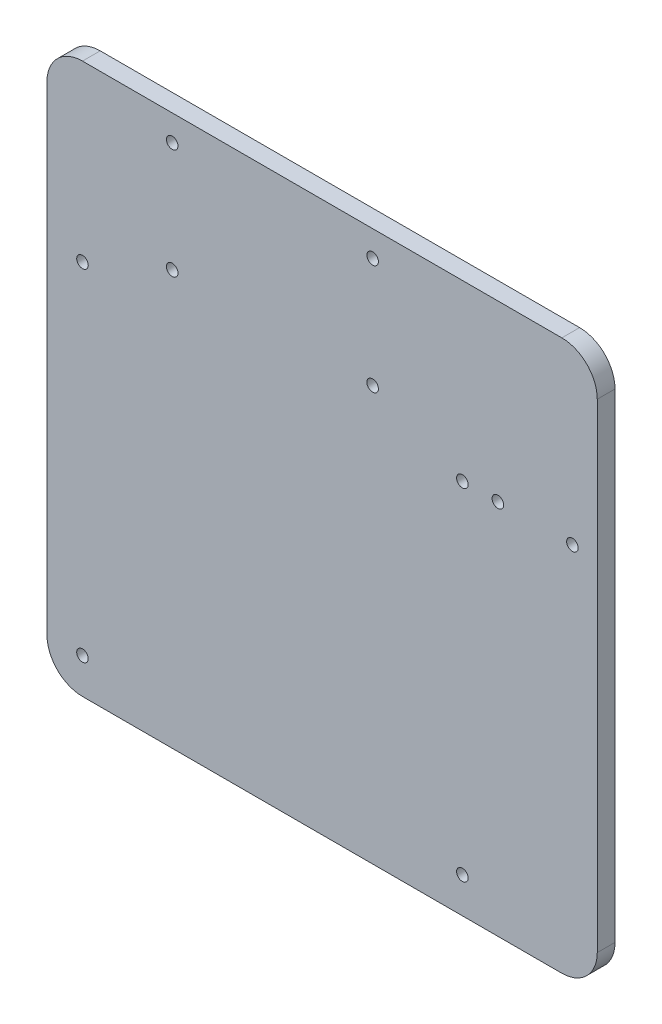
ISO-10303-21;
HEADER;
FILE_DESCRIPTION(('STEP AP214'),'2;1');
FILE_NAME('part.step','',(''),(''),'','','');
FILE_SCHEMA(('AUTOMOTIVE_DESIGN { 1 0 10303 214 1 1 1 1 }'));
ENDSEC;
DATA;
#1=APPLICATION_CONTEXT('core data for automotive mechanical design processes');
#2=APPLICATION_PROTOCOL_DEFINITION('international standard','automotive_design',2000,#1);
#3=PRODUCT_CONTEXT('',#1,'mechanical');
#4=PRODUCT('Part','Part','',(#3));
#5=PRODUCT_RELATED_PRODUCT_CATEGORY('part','',(#4));
#6=PRODUCT_DEFINITION_FORMATION('','',#4);
#7=PRODUCT_DEFINITION_CONTEXT('part definition',#1,'design');
#8=PRODUCT_DEFINITION('design','',#6,#7);
#9=PRODUCT_DEFINITION_SHAPE('','',#8);
#10=(LENGTH_UNIT() NAMED_UNIT(*) SI_UNIT(.MILLI.,.METRE.));
#11=(NAMED_UNIT(*) PLANE_ANGLE_UNIT() SI_UNIT($,.RADIAN.));
#12=(NAMED_UNIT(*) SI_UNIT($,.STERADIAN.) SOLID_ANGLE_UNIT());
#13=UNCERTAINTY_MEASURE_WITH_UNIT(LENGTH_MEASURE(1.E-05),#10,'distance_accuracy_value','');
#14=(GEOMETRIC_REPRESENTATION_CONTEXT(3) GLOBAL_UNCERTAINTY_ASSIGNED_CONTEXT((#13)) GLOBAL_UNIT_ASSIGNED_CONTEXT((#10,
#11,#12)) REPRESENTATION_CONTEXT('',''));
#15=CARTESIAN_POINT('',(0.,0.,0.));
#16=DIRECTION('',(0.,0.,1.));
#17=DIRECTION('',(1.,0.,0.));
#18=AXIS2_PLACEMENT_3D('',#15,#16,#17);
#19=CARTESIAN_POINT('',(-75.,75.,5.));
#20=DIRECTION('',(1.,0.,0.));
#21=DIRECTION('',(0.,1.,0.));
#22=AXIS2_PLACEMENT_3D('',#19,#20,#21);
#23=PLANE('',#22);
#24=DIRECTION('',(0.,0.,1.));
#25=VECTOR('',#24,1.);
#26=CARTESIAN_POINT('',(-75.,-65.,0.));
#27=LINE('',#26,#25);
#28=CARTESIAN_POINT('',(-75.,-65.,0.));
#29=VERTEX_POINT('',#28);
#30=CARTESIAN_POINT('',(-74.9999999999992,-65.,5.));
#31=VERTEX_POINT('',#30);
#32=EDGE_CURVE('E96',#29,#31,#27,.T.);
#33=ORIENTED_EDGE('',*,*,#32,.T.);
#34=DIRECTION('',(0.,-1.,0.));
#35=VECTOR('',#34,1.);
#36=CARTESIAN_POINT('',(-75.,75.,5.));
#37=LINE('',#36,#35);
#38=CARTESIAN_POINT('',(-75.,70.0055578210012,5.));
#39=VERTEX_POINT('',#38);
#40=EDGE_CURVE('E11',#39,#31,#37,.T.);
#41=ORIENTED_EDGE('',*,*,#40,.F.);
#42=DIRECTION('',(0.,0.,1.));
#43=VECTOR('',#42,1.);
#44=CARTESIAN_POINT('',(-75.,70.0055578210012,0.));
#45=LINE('',#44,#43);
#46=CARTESIAN_POINT('',(-75.,70.0055578210012,0.));
#47=VERTEX_POINT('',#46);
#48=EDGE_CURVE('E116',#47,#39,#45,.T.);
#49=ORIENTED_EDGE('',*,*,#48,.F.);
#50=DIRECTION('',(0.,-1.,0.));
#51=VECTOR('',#50,1.);
#52=CARTESIAN_POINT('',(-75.,75.,0.));
#53=LINE('',#52,#51);
#54=EDGE_CURVE('E112',#47,#29,#53,.T.);
#55=ORIENTED_EDGE('',*,*,#54,.T.);
#56=EDGE_LOOP('',(#33,#41,#49,#55));
#57=FACE_BOUND('',#56,.T.);
#58=ADVANCED_FACE('F31',(#57),#23,.F.);
#59=CARTESIAN_POINT('',(-75.,-75.,5.));
#60=DIRECTION('',(0.,1.,0.));
#61=DIRECTION('',(-1.,0.,0.));
#62=AXIS2_PLACEMENT_3D('',#59,#60,#61);
#63=PLANE('',#62);
#64=DIRECTION('',(1.,0.,0.));
#65=VECTOR('',#64,1.);
#66=CARTESIAN_POINT('',(80.,-75.,5.));
#67=LINE('',#66,#65);
#68=CARTESIAN_POINT('',(-65.,-75.,5.));
#69=VERTEX_POINT('',#68);
#70=CARTESIAN_POINT('',(69.9697939002767,-75.,5.));
#71=VERTEX_POINT('',#70);
#72=EDGE_CURVE('E55',#69,#71,#67,.T.);
#73=ORIENTED_EDGE('',*,*,#72,.F.);
#74=DIRECTION('',(0.,0.,1.));
#75=VECTOR('',#74,1.);
#76=CARTESIAN_POINT('',(-65.,-75.,0.));
#77=LINE('',#76,#75);
#78=CARTESIAN_POINT('',(-65.,-75.,0.));
#79=VERTEX_POINT('',#78);
#80=EDGE_CURVE('E104',#79,#69,#77,.T.);
#81=ORIENTED_EDGE('',*,*,#80,.F.);
#82=DIRECTION('',(1.,0.,0.));
#83=VECTOR('',#82,1.);
#84=CARTESIAN_POINT('',(-75.,-75.,0.));
#85=LINE('',#84,#83);
#86=CARTESIAN_POINT('',(69.9697939002767,-75.,0.));
#87=VERTEX_POINT('',#86);
#88=EDGE_CURVE('E35',#79,#87,#85,.T.);
#89=ORIENTED_EDGE('',*,*,#88,.T.);
#90=DIRECTION('',(0.,0.,1.));
#91=VECTOR('',#90,1.);
#92=CARTESIAN_POINT('',(69.9697939002767,-75.,0.));
#93=LINE('',#92,#91);
#94=EDGE_CURVE('E207',#87,#71,#93,.T.);
#95=ORIENTED_EDGE('',*,*,#94,.T.);
#96=EDGE_LOOP('',(#73,#81,#89,#95));
#97=FACE_BOUND('',#96,.T.);
#98=ADVANCED_FACE('F220',(#97),#63,.F.);
#99=CARTESIAN_POINT('',(80.,80.,5.));
#100=DIRECTION('',(-1.,0.,0.));
#101=DIRECTION('',(0.,0.,1.));
#102=AXIS2_PLACEMENT_3D('',#99,#100,#101);
#103=PLANE('',#102);
#104=DIRECTION('',(0.,1.,0.));
#105=VECTOR('',#104,1.);
#106=CARTESIAN_POINT('',(80.,80.,5.));
#107=LINE('',#106,#105);
#108=CARTESIAN_POINT('',(80.,-64.9697939002768,5.));
#109=VERTEX_POINT('',#108);
#110=CARTESIAN_POINT('',(80.,70.024463879748,5.));
#111=VERTEX_POINT('',#110);
#112=EDGE_CURVE('E124',#109,#111,#107,.T.);
#113=ORIENTED_EDGE('',*,*,#112,.F.);
#114=DIRECTION('',(0.,0.,1.));
#115=VECTOR('',#114,1.);
#116=CARTESIAN_POINT('',(80.,-64.9697939002768,0.));
#117=LINE('',#116,#115);
#118=CARTESIAN_POINT('',(80.,-64.9697939002768,0.));
#119=VERTEX_POINT('',#118);
#120=EDGE_CURVE('E204',#119,#109,#117,.T.);
#121=ORIENTED_EDGE('',*,*,#120,.F.);
#122=DIRECTION('',(0.,1.,0.));
#123=VECTOR('',#122,1.);
#124=CARTESIAN_POINT('',(80.,80.,0.));
#125=LINE('',#124,#123);
#126=CARTESIAN_POINT('',(80.,70.024463879748,0.));
#127=VERTEX_POINT('',#126);
#128=EDGE_CURVE('E118',#119,#127,#125,.T.);
#129=ORIENTED_EDGE('',*,*,#128,.T.);
#130=DIRECTION('',(0.,0.,1.));
#131=VECTOR('',#130,1.);
#132=CARTESIAN_POINT('',(80.,70.024463879748,0.));
#133=LINE('',#132,#131);
#134=EDGE_CURVE('E196',#127,#111,#133,.T.);
#135=ORIENTED_EDGE('',*,*,#134,.T.);
#136=EDGE_LOOP('',(#113,#121,#129,#135));
#137=FACE_BOUND('',#136,.T.);
#138=ADVANCED_FACE('F33',(#137),#103,.F.);
#139=CARTESIAN_POINT('',(-75.,80.,5.));
#140=DIRECTION('',(0.,-1.,0.));
#141=DIRECTION('',(0.,0.,-1.));
#142=AXIS2_PLACEMENT_3D('',#139,#140,#141);
#143=PLANE('',#142);
#144=DIRECTION('',(-1.,0.,0.));
#145=VECTOR('',#144,1.);
#146=CARTESIAN_POINT('',(75.,80.,5.));
#147=LINE('',#146,#145);
#148=CARTESIAN_POINT('',(70.024463879748,80.,5.));
#149=VERTEX_POINT('',#148);
#150=CARTESIAN_POINT('',(-65.0055578210013,80.,5.));
#151=VERTEX_POINT('',#150);
#152=EDGE_CURVE('E40',#149,#151,#147,.T.);
#153=ORIENTED_EDGE('',*,*,#152,.F.);
#154=DIRECTION('',(0.,0.,1.));
#155=VECTOR('',#154,1.);
#156=CARTESIAN_POINT('',(70.024463879748,80.,0.));
#157=LINE('',#156,#155);
#158=CARTESIAN_POINT('',(70.024463879748,80.,0.));
#159=VERTEX_POINT('',#158);
#160=EDGE_CURVE('E194',#159,#149,#157,.T.);
#161=ORIENTED_EDGE('',*,*,#160,.F.);
#162=DIRECTION('',(-1.,0.,0.));
#163=VECTOR('',#162,1.);
#164=CARTESIAN_POINT('',(-75.,80.,0.));
#165=LINE('',#164,#163);
#166=CARTESIAN_POINT('',(-65.0055578210013,80.,0.));
#167=VERTEX_POINT('',#166);
#168=EDGE_CURVE('E117',#159,#167,#165,.T.);
#169=ORIENTED_EDGE('',*,*,#168,.T.);
#170=DIRECTION('',(0.,0.,1.));
#171=VECTOR('',#170,1.);
#172=CARTESIAN_POINT('',(-65.0055578210013,80.,0.));
#173=LINE('',#172,#171);
#174=EDGE_CURVE('E186',#167,#151,#173,.T.);
#175=ORIENTED_EDGE('',*,*,#174,.T.);
#176=EDGE_LOOP('',(#153,#161,#169,#175));
#177=FACE_BOUND('',#176,.T.);
#178=ADVANCED_FACE('F236',(#177),#143,.F.);
#179=CARTESIAN_POINT('',(-75.,-74.9999999999996,5.));
#180=DIRECTION('',(0.,0.,1.));
#181=DIRECTION('',(1.,0.,0.));
#182=AXIS2_PLACEMENT_3D('',#179,#180,#181);
#183=PLANE('',#182);
#184=CARTESIAN_POINT('',(-65.,-65.,5.));
#185=DIRECTION('',(0.,0.,-1.));
#186=DIRECTION('',(1.,0.,0.));
#187=AXIS2_PLACEMENT_3D('',#184,#185,#186);
#188=CIRCLE('',#187,9.99999999999999);
#189=EDGE_CURVE('E48',#69,#31,#188,.T.);
#190=ORIENTED_EDGE('',*,*,#189,.F.);
#191=ORIENTED_EDGE('',*,*,#72,.T.);
#192=CARTESIAN_POINT('',(69.9697939002767,-64.9697939002768,5.));
#193=DIRECTION('',(0.,0.,-1.));
#194=DIRECTION('',(1.,0.,0.));
#195=AXIS2_PLACEMENT_3D('',#192,#193,#194);
#196=CIRCLE('',#195,10.0302060997233);
#197=EDGE_CURVE('E212',#109,#71,#196,.T.);
#198=ORIENTED_EDGE('',*,*,#197,.F.);
#199=ORIENTED_EDGE('',*,*,#112,.T.);
#200=CARTESIAN_POINT('',(70.024463879748,70.024463879748,5.));
#201=DIRECTION('',(0.,0.,-1.));
#202=DIRECTION('',(1.,0.,0.));
#203=AXIS2_PLACEMENT_3D('',#200,#201,#202);
#204=CIRCLE('',#203,9.97553612025197);
#205=EDGE_CURVE('E201',#149,#111,#204,.T.);
#206=ORIENTED_EDGE('',*,*,#205,.F.);
#207=ORIENTED_EDGE('',*,*,#152,.T.);
#208=CARTESIAN_POINT('',(-65.0055578210013,70.0055578210012,5.));
#209=DIRECTION('',(0.,0.,-1.));
#210=DIRECTION('',(1.,0.,0.));
#211=AXIS2_PLACEMENT_3D('',#208,#209,#210);
#212=CIRCLE('',#211,9.99444217899877);
#213=EDGE_CURVE('E191',#39,#151,#212,.T.);
#214=ORIENTED_EDGE('',*,*,#213,.F.);
#215=ORIENTED_EDGE('',*,*,#40,.T.);
#216=EDGE_LOOP('',(#190,#191,#198,#199,#206,#207,#214,#215));
#217=FACE_BOUND('',#216,.T.);
#218=CARTESIAN_POINT('',(16.7280677159057,41.7212113135208,5.));
#219=DIRECTION('',(0.,0.,1.));
#220=DIRECTION('',(1.,0.,0.));
#221=AXIS2_PLACEMENT_3D('',#218,#219,#220);
#222=CIRCLE('',#221,1.625);
#223=CARTESIAN_POINT('',(18.3530677159057,41.7212113135208,5.));
#224=VERTEX_POINT('',#223);
#225=EDGE_CURVE('E172',#224,#224,#222,.T.);
#226=ORIENTED_EDGE('',*,*,#225,.F.);
#227=EDGE_LOOP('',(#226));
#228=FACE_BOUND('',#227,.T.);
#229=CARTESIAN_POINT('',(-39.7280677159057,72.7212113135208,5.));
#230=DIRECTION('',(0.,0.,1.));
#231=DIRECTION('',(1.,0.,0.));
#232=AXIS2_PLACEMENT_3D('',#229,#230,#231);
#233=CIRCLE('',#232,1.625);
#234=CARTESIAN_POINT('',(-38.1030677159057,72.7212113135208,5.));
#235=VERTEX_POINT('',#234);
#236=EDGE_CURVE('E160',#235,#235,#233,.T.);
#237=ORIENTED_EDGE('',*,*,#236,.F.);
#238=EDGE_LOOP('',(#237));
#239=FACE_BOUND('',#238,.T.);
#240=CARTESIAN_POINT('',(52.,31.,5.));
#241=DIRECTION('',(0.,0.,1.));
#242=DIRECTION('',(1.,0.,0.));
#243=AXIS2_PLACEMENT_3D('',#240,#241,#242);
#244=CIRCLE('',#243,1.625);
#245=CARTESIAN_POINT('',(53.625,31.,5.));
#246=VERTEX_POINT('',#245);
#247=EDGE_CURVE('E148',#246,#246,#244,.T.);
#248=ORIENTED_EDGE('',*,*,#247,.F.);
#249=EDGE_LOOP('',(#248));
#250=FACE_BOUND('',#249,.T.);
#251=CARTESIAN_POINT('',(42.,31.,5.));
#252=DIRECTION('',(0.,0.,1.));
#253=DIRECTION('',(1.,0.,0.));
#254=AXIS2_PLACEMENT_3D('',#251,#252,#253);
#255=CIRCLE('',#254,1.625);
#256=CARTESIAN_POINT('',(43.625,31.,5.));
#257=VERTEX_POINT('',#256);
#258=EDGE_CURVE('E136',#257,#257,#255,.T.);
#259=ORIENTED_EDGE('',*,*,#258,.F.);
#260=EDGE_LOOP('',(#259));
#261=FACE_BOUND('',#260,.T.);
#262=CARTESIAN_POINT('',(-65.,-65.,5.));
#263=DIRECTION('',(0.,0.,1.));
#264=DIRECTION('',(1.,0.,0.));
#265=AXIS2_PLACEMENT_3D('',#262,#263,#264);
#266=CIRCLE('',#265,1.625);
#267=CARTESIAN_POINT('',(-63.375,-65.,5.));
#268=VERTEX_POINT('',#267);
#269=EDGE_CURVE('E121',#268,#268,#266,.T.);
#270=ORIENTED_EDGE('',*,*,#269,.F.);
#271=EDGE_LOOP('',(#270));
#272=FACE_BOUND('',#271,.T.);
#273=CARTESIAN_POINT('',(-65.,31.,5.));
#274=DIRECTION('',(0.,0.,1.));
#275=DIRECTION('',(1.,0.,0.));
#276=AXIS2_PLACEMENT_3D('',#273,#274,#275);
#277=CIRCLE('',#276,1.625);
#278=CARTESIAN_POINT('',(-63.375,31.,5.));
#279=VERTEX_POINT('',#278);
#280=EDGE_CURVE('E130',#279,#279,#277,.T.);
#281=ORIENTED_EDGE('',*,*,#280,.F.);
#282=EDGE_LOOP('',(#281));
#283=FACE_BOUND('',#282,.T.);
#284=CARTESIAN_POINT('',(42.,-65.,5.));
#285=DIRECTION('',(0.,0.,1.));
#286=DIRECTION('',(1.,0.,0.));
#287=AXIS2_PLACEMENT_3D('',#284,#285,#286);
#288=CIRCLE('',#287,1.625);
#289=CARTESIAN_POINT('',(43.625,-65.,5.));
#290=VERTEX_POINT('',#289);
#291=EDGE_CURVE('E142',#290,#290,#288,.T.);
#292=ORIENTED_EDGE('',*,*,#291,.F.);
#293=EDGE_LOOP('',(#292));
#294=FACE_BOUND('',#293,.T.);
#295=CARTESIAN_POINT('',(73.,31.,5.));
#296=DIRECTION('',(0.,0.,1.));
#297=DIRECTION('',(1.,0.,0.));
#298=AXIS2_PLACEMENT_3D('',#295,#296,#297);
#299=CIRCLE('',#298,1.625);
#300=CARTESIAN_POINT('',(74.625,31.,5.));
#301=VERTEX_POINT('',#300);
#302=EDGE_CURVE('E154',#301,#301,#299,.T.);
#303=ORIENTED_EDGE('',*,*,#302,.F.);
#304=EDGE_LOOP('',(#303));
#305=FACE_BOUND('',#304,.T.);
#306=CARTESIAN_POINT('',(-39.7280677159057,41.7212113135208,5.));
#307=DIRECTION('',(0.,0.,1.));
#308=DIRECTION('',(1.,0.,0.));
#309=AXIS2_PLACEMENT_3D('',#306,#307,#308);
#310=CIRCLE('',#309,1.625);
#311=CARTESIAN_POINT('',(-38.1030677159057,41.7212113135208,5.));
#312=VERTEX_POINT('',#311);
#313=EDGE_CURVE('E166',#312,#312,#310,.T.);
#314=ORIENTED_EDGE('',*,*,#313,.F.);
#315=EDGE_LOOP('',(#314));
#316=FACE_BOUND('',#315,.T.);
#317=CARTESIAN_POINT('',(16.7280677159057,72.7212113135208,5.));
#318=DIRECTION('',(0.,0.,1.));
#319=DIRECTION('',(1.,0.,0.));
#320=AXIS2_PLACEMENT_3D('',#317,#318,#319);
#321=CIRCLE('',#320,1.625);
#322=CARTESIAN_POINT('',(18.3530677159057,72.7212113135208,5.));
#323=VERTEX_POINT('',#322);
#324=EDGE_CURVE('E178',#323,#323,#321,.T.);
#325=ORIENTED_EDGE('',*,*,#324,.F.);
#326=EDGE_LOOP('',(#325));
#327=FACE_BOUND('',#326,.T.);
#328=ADVANCED_FACE('F217',(#217,#228,#239,#250,#261,#272,#283,#294,#305,#316,#327),#183,.T.);
#329=CARTESIAN_POINT('',(-75.,-74.9999999999996,0.));
#330=DIRECTION('',(0.,0.,1.));
#331=DIRECTION('',(1.,0.,0.));
#332=AXIS2_PLACEMENT_3D('',#329,#330,#331);
#333=PLANE('',#332);
#334=CARTESIAN_POINT('',(16.7280677159057,41.7212113135208,0.));
#335=DIRECTION('',(0.,0.,1.));
#336=DIRECTION('',(1.,0.,0.));
#337=AXIS2_PLACEMENT_3D('',#334,#335,#336);
#338=CIRCLE('',#337,1.625);
#339=CARTESIAN_POINT('',(18.3530677159057,41.7212113135208,0.));
#340=VERTEX_POINT('',#339);
#341=EDGE_CURVE('E175',#340,#340,#338,.T.);
#342=ORIENTED_EDGE('',*,*,#341,.T.);
#343=EDGE_LOOP('',(#342));
#344=FACE_BOUND('',#343,.T.);
#345=CARTESIAN_POINT('',(-39.7280677159057,72.7212113135208,0.));
#346=DIRECTION('',(0.,0.,1.));
#347=DIRECTION('',(1.,0.,0.));
#348=AXIS2_PLACEMENT_3D('',#345,#346,#347);
#349=CIRCLE('',#348,1.625);
#350=CARTESIAN_POINT('',(-38.1030677159057,72.7212113135208,0.));
#351=VERTEX_POINT('',#350);
#352=EDGE_CURVE('E163',#351,#351,#349,.T.);
#353=ORIENTED_EDGE('',*,*,#352,.T.);
#354=EDGE_LOOP('',(#353));
#355=FACE_BOUND('',#354,.T.);
#356=CARTESIAN_POINT('',(52.,31.,0.));
#357=DIRECTION('',(0.,0.,1.));
#358=DIRECTION('',(1.,0.,0.));
#359=AXIS2_PLACEMENT_3D('',#356,#357,#358);
#360=CIRCLE('',#359,1.625);
#361=CARTESIAN_POINT('',(53.625,31.,0.));
#362=VERTEX_POINT('',#361);
#363=EDGE_CURVE('E151',#362,#362,#360,.T.);
#364=ORIENTED_EDGE('',*,*,#363,.T.);
#365=EDGE_LOOP('',(#364));
#366=FACE_BOUND('',#365,.T.);
#367=CARTESIAN_POINT('',(42.,31.,0.));
#368=DIRECTION('',(0.,0.,1.));
#369=DIRECTION('',(1.,0.,0.));
#370=AXIS2_PLACEMENT_3D('',#367,#368,#369);
#371=CIRCLE('',#370,1.625);
#372=CARTESIAN_POINT('',(43.625,31.,0.));
#373=VERTEX_POINT('',#372);
#374=EDGE_CURVE('E139',#373,#373,#371,.T.);
#375=ORIENTED_EDGE('',*,*,#374,.T.);
#376=EDGE_LOOP('',(#375));
#377=FACE_BOUND('',#376,.T.);
#378=CARTESIAN_POINT('',(-65.,-65.,0.));
#379=DIRECTION('',(0.,0.,1.));
#380=DIRECTION('',(1.,0.,0.));
#381=AXIS2_PLACEMENT_3D('',#378,#379,#380);
#382=CIRCLE('',#381,1.625);
#383=CARTESIAN_POINT('',(-63.375,-65.,0.));
#384=VERTEX_POINT('',#383);
#385=EDGE_CURVE('E127',#384,#384,#382,.T.);
#386=ORIENTED_EDGE('',*,*,#385,.T.);
#387=EDGE_LOOP('',(#386));
#388=FACE_BOUND('',#387,.T.);
#389=ORIENTED_EDGE('',*,*,#88,.F.);
#390=CARTESIAN_POINT('',(-65.,-65.,0.));
#391=DIRECTION('',(0.,0.,-1.));
#392=DIRECTION('',(1.,0.,0.));
#393=AXIS2_PLACEMENT_3D('',#390,#391,#392);
#394=CIRCLE('',#393,9.99999999999999);
#395=EDGE_CURVE('E99',#79,#29,#394,.T.);
#396=ORIENTED_EDGE('',*,*,#395,.T.);
#397=ORIENTED_EDGE('',*,*,#54,.F.);
#398=CARTESIAN_POINT('',(-65.0055578210013,70.0055578210012,0.));
#399=DIRECTION('',(0.,0.,-1.));
#400=DIRECTION('',(1.,0.,0.));
#401=AXIS2_PLACEMENT_3D('',#398,#399,#400);
#402=CIRCLE('',#401,9.99444217899877);
#403=EDGE_CURVE('E189',#47,#167,#402,.T.);
#404=ORIENTED_EDGE('',*,*,#403,.T.);
#405=ORIENTED_EDGE('',*,*,#168,.F.);
#406=CARTESIAN_POINT('',(70.024463879748,70.024463879748,0.));
#407=DIRECTION('',(0.,0.,-1.));
#408=DIRECTION('',(1.,0.,0.));
#409=AXIS2_PLACEMENT_3D('',#406,#407,#408);
#410=CIRCLE('',#409,9.97553612025197);
#411=EDGE_CURVE('E199',#159,#127,#410,.T.);
#412=ORIENTED_EDGE('',*,*,#411,.T.);
#413=ORIENTED_EDGE('',*,*,#128,.F.);
#414=CARTESIAN_POINT('',(69.9697939002767,-64.9697939002768,0.));
#415=DIRECTION('',(0.,0.,-1.));
#416=DIRECTION('',(1.,0.,0.));
#417=AXIS2_PLACEMENT_3D('',#414,#415,#416);
#418=CIRCLE('',#417,10.0302060997233);
#419=EDGE_CURVE('E210',#119,#87,#418,.T.);
#420=ORIENTED_EDGE('',*,*,#419,.T.);
#421=EDGE_LOOP('',(#389,#396,#397,#404,#405,#412,#413,#420));
#422=FACE_BOUND('',#421,.T.);
#423=CARTESIAN_POINT('',(-65.,31.,0.));
#424=DIRECTION('',(0.,0.,1.));
#425=DIRECTION('',(1.,0.,0.));
#426=AXIS2_PLACEMENT_3D('',#423,#424,#425);
#427=CIRCLE('',#426,1.625);
#428=CARTESIAN_POINT('',(-63.375,31.,0.));
#429=VERTEX_POINT('',#428);
#430=EDGE_CURVE('E133',#429,#429,#427,.T.);
#431=ORIENTED_EDGE('',*,*,#430,.T.);
#432=EDGE_LOOP('',(#431));
#433=FACE_BOUND('',#432,.T.);
#434=CARTESIAN_POINT('',(42.,-65.,0.));
#435=DIRECTION('',(0.,0.,1.));
#436=DIRECTION('',(1.,0.,0.));
#437=AXIS2_PLACEMENT_3D('',#434,#435,#436);
#438=CIRCLE('',#437,1.625);
#439=CARTESIAN_POINT('',(43.625,-65.,0.));
#440=VERTEX_POINT('',#439);
#441=EDGE_CURVE('E145',#440,#440,#438,.T.);
#442=ORIENTED_EDGE('',*,*,#441,.T.);
#443=EDGE_LOOP('',(#442));
#444=FACE_BOUND('',#443,.T.);
#445=CARTESIAN_POINT('',(73.,31.,0.));
#446=DIRECTION('',(0.,0.,1.));
#447=DIRECTION('',(1.,0.,0.));
#448=AXIS2_PLACEMENT_3D('',#445,#446,#447);
#449=CIRCLE('',#448,1.625);
#450=CARTESIAN_POINT('',(74.625,31.,0.));
#451=VERTEX_POINT('',#450);
#452=EDGE_CURVE('E157',#451,#451,#449,.T.);
#453=ORIENTED_EDGE('',*,*,#452,.T.);
#454=EDGE_LOOP('',(#453));
#455=FACE_BOUND('',#454,.T.);
#456=CARTESIAN_POINT('',(-39.7280677159057,41.7212113135208,0.));
#457=DIRECTION('',(0.,0.,1.));
#458=DIRECTION('',(1.,0.,0.));
#459=AXIS2_PLACEMENT_3D('',#456,#457,#458);
#460=CIRCLE('',#459,1.625);
#461=CARTESIAN_POINT('',(-38.1030677159057,41.7212113135208,0.));
#462=VERTEX_POINT('',#461);
#463=EDGE_CURVE('E169',#462,#462,#460,.T.);
#464=ORIENTED_EDGE('',*,*,#463,.T.);
#465=EDGE_LOOP('',(#464));
#466=FACE_BOUND('',#465,.T.);
#467=CARTESIAN_POINT('',(16.7280677159057,72.7212113135208,0.));
#468=DIRECTION('',(0.,0.,1.));
#469=DIRECTION('',(1.,0.,0.));
#470=AXIS2_PLACEMENT_3D('',#467,#468,#469);
#471=CIRCLE('',#470,1.625);
#472=CARTESIAN_POINT('',(18.3530677159057,72.7212113135208,0.));
#473=VERTEX_POINT('',#472);
#474=EDGE_CURVE('E181',#473,#473,#471,.T.);
#475=ORIENTED_EDGE('',*,*,#474,.T.);
#476=EDGE_LOOP('',(#475));
#477=FACE_BOUND('',#476,.T.);
#478=ADVANCED_FACE('F109',(#344,#355,#366,#377,#388,#422,#433,#444,#455,#466,#477),#333,.F.);
#479=CARTESIAN_POINT('',(-65.,-65.,5.));
#480=DIRECTION('',(0.,0.,-1.));
#481=DIRECTION('',(-1.,0.,0.));
#482=AXIS2_PLACEMENT_3D('',#479,#480,#481);
#483=CYLINDRICAL_SURFACE('',#482,1.625);
#484=ORIENTED_EDGE('',*,*,#269,.T.);
#485=EDGE_LOOP('',(#484));
#486=FACE_BOUND('',#485,.T.);
#487=ORIENTED_EDGE('',*,*,#385,.F.);
#488=EDGE_LOOP('',(#487));
#489=FACE_BOUND('',#488,.T.);
#490=ADVANCED_FACE('F363',(#486,#489),#483,.F.);
#491=CARTESIAN_POINT('',(-65.,31.,5.));
#492=DIRECTION('',(0.,0.,-1.));
#493=DIRECTION('',(-1.,0.,0.));
#494=AXIS2_PLACEMENT_3D('',#491,#492,#493);
#495=CYLINDRICAL_SURFACE('',#494,1.625);
#496=ORIENTED_EDGE('',*,*,#280,.T.);
#497=EDGE_LOOP('',(#496));
#498=FACE_BOUND('',#497,.T.);
#499=ORIENTED_EDGE('',*,*,#430,.F.);
#500=EDGE_LOOP('',(#499));
#501=FACE_BOUND('',#500,.T.);
#502=ADVANCED_FACE('F353',(#498,#501),#495,.F.);
#503=CARTESIAN_POINT('',(42.,31.,5.));
#504=DIRECTION('',(0.,0.,-1.));
#505=DIRECTION('',(-1.,0.,0.));
#506=AXIS2_PLACEMENT_3D('',#503,#504,#505);
#507=CYLINDRICAL_SURFACE('',#506,1.625);
#508=ORIENTED_EDGE('',*,*,#258,.T.);
#509=EDGE_LOOP('',(#508));
#510=FACE_BOUND('',#509,.T.);
#511=ORIENTED_EDGE('',*,*,#374,.F.);
#512=EDGE_LOOP('',(#511));
#513=FACE_BOUND('',#512,.T.);
#514=ADVANCED_FACE('F343',(#510,#513),#507,.F.);
#515=CARTESIAN_POINT('',(42.,-65.,5.));
#516=DIRECTION('',(0.,0.,-1.));
#517=DIRECTION('',(-1.,0.,0.));
#518=AXIS2_PLACEMENT_3D('',#515,#516,#517);
#519=CYLINDRICAL_SURFACE('',#518,1.625);
#520=ORIENTED_EDGE('',*,*,#291,.T.);
#521=EDGE_LOOP('',(#520));
#522=FACE_BOUND('',#521,.T.);
#523=ORIENTED_EDGE('',*,*,#441,.F.);
#524=EDGE_LOOP('',(#523));
#525=FACE_BOUND('',#524,.T.);
#526=ADVANCED_FACE('F333',(#522,#525),#519,.F.);
#527=CARTESIAN_POINT('',(52.,31.,5.));
#528=DIRECTION('',(0.,0.,-1.));
#529=DIRECTION('',(-1.,0.,0.));
#530=AXIS2_PLACEMENT_3D('',#527,#528,#529);
#531=CYLINDRICAL_SURFACE('',#530,1.625);
#532=ORIENTED_EDGE('',*,*,#247,.T.);
#533=EDGE_LOOP('',(#532));
#534=FACE_BOUND('',#533,.T.);
#535=ORIENTED_EDGE('',*,*,#363,.F.);
#536=EDGE_LOOP('',(#535));
#537=FACE_BOUND('',#536,.T.);
#538=ADVANCED_FACE('F323',(#534,#537),#531,.F.);
#539=CARTESIAN_POINT('',(73.,31.,5.));
#540=DIRECTION('',(0.,0.,-1.));
#541=DIRECTION('',(-1.,0.,0.));
#542=AXIS2_PLACEMENT_3D('',#539,#540,#541);
#543=CYLINDRICAL_SURFACE('',#542,1.625);
#544=ORIENTED_EDGE('',*,*,#302,.T.);
#545=EDGE_LOOP('',(#544));
#546=FACE_BOUND('',#545,.T.);
#547=ORIENTED_EDGE('',*,*,#452,.F.);
#548=EDGE_LOOP('',(#547));
#549=FACE_BOUND('',#548,.T.);
#550=ADVANCED_FACE('F313',(#546,#549),#543,.F.);
#551=CARTESIAN_POINT('',(-39.7280677159057,72.7212113135208,5.));
#552=DIRECTION('',(0.,0.,-1.));
#553=DIRECTION('',(-1.,0.,0.));
#554=AXIS2_PLACEMENT_3D('',#551,#552,#553);
#555=CYLINDRICAL_SURFACE('',#554,1.625);
#556=ORIENTED_EDGE('',*,*,#236,.T.);
#557=EDGE_LOOP('',(#556));
#558=FACE_BOUND('',#557,.T.);
#559=ORIENTED_EDGE('',*,*,#352,.F.);
#560=EDGE_LOOP('',(#559));
#561=FACE_BOUND('',#560,.T.);
#562=ADVANCED_FACE('F303',(#558,#561),#555,.F.);
#563=CARTESIAN_POINT('',(-39.7280677159057,41.7212113135208,5.));
#564=DIRECTION('',(0.,0.,-1.));
#565=DIRECTION('',(-1.,0.,0.));
#566=AXIS2_PLACEMENT_3D('',#563,#564,#565);
#567=CYLINDRICAL_SURFACE('',#566,1.625);
#568=ORIENTED_EDGE('',*,*,#313,.T.);
#569=EDGE_LOOP('',(#568));
#570=FACE_BOUND('',#569,.T.);
#571=ORIENTED_EDGE('',*,*,#463,.F.);
#572=EDGE_LOOP('',(#571));
#573=FACE_BOUND('',#572,.T.);
#574=ADVANCED_FACE('F293',(#570,#573),#567,.F.);
#575=CARTESIAN_POINT('',(16.7280677159057,41.7212113135208,5.));
#576=DIRECTION('',(0.,0.,-1.));
#577=DIRECTION('',(-1.,0.,0.));
#578=AXIS2_PLACEMENT_3D('',#575,#576,#577);
#579=CYLINDRICAL_SURFACE('',#578,1.625);
#580=ORIENTED_EDGE('',*,*,#225,.T.);
#581=EDGE_LOOP('',(#580));
#582=FACE_BOUND('',#581,.T.);
#583=ORIENTED_EDGE('',*,*,#341,.F.);
#584=EDGE_LOOP('',(#583));
#585=FACE_BOUND('',#584,.T.);
#586=ADVANCED_FACE('F248',(#582,#585),#579,.F.);
#587=CARTESIAN_POINT('',(16.7280677159057,72.7212113135208,5.));
#588=DIRECTION('',(0.,0.,-1.));
#589=DIRECTION('',(-1.,0.,0.));
#590=AXIS2_PLACEMENT_3D('',#587,#588,#589);
#591=CYLINDRICAL_SURFACE('',#590,1.625);
#592=ORIENTED_EDGE('',*,*,#324,.T.);
#593=EDGE_LOOP('',(#592));
#594=FACE_BOUND('',#593,.T.);
#595=ORIENTED_EDGE('',*,*,#474,.F.);
#596=EDGE_LOOP('',(#595));
#597=FACE_BOUND('',#596,.T.);
#598=ADVANCED_FACE('F241',(#594,#597),#591,.F.);
#599=CARTESIAN_POINT('',(-65.0055578210013,70.0055578210012,0.));
#600=DIRECTION('',(0.,0.,1.));
#601=DIRECTION('',(1.,0.,0.));
#602=AXIS2_PLACEMENT_3D('',#599,#600,#601);
#603=CYLINDRICAL_SURFACE('',#602,9.99444217899877);
#604=ORIENTED_EDGE('',*,*,#213,.T.);
#605=ORIENTED_EDGE('',*,*,#174,.F.);
#606=ORIENTED_EDGE('',*,*,#403,.F.);
#607=ORIENTED_EDGE('',*,*,#48,.T.);
#608=EDGE_LOOP('',(#604,#605,#606,#607));
#609=FACE_BOUND('',#608,.T.);
#610=ADVANCED_FACE('F239',(#609),#603,.T.);
#611=CARTESIAN_POINT('',(70.024463879748,70.024463879748,0.));
#612=DIRECTION('',(0.,0.,1.));
#613=DIRECTION('',(1.,0.,0.));
#614=AXIS2_PLACEMENT_3D('',#611,#612,#613);
#615=CYLINDRICAL_SURFACE('',#614,9.97553612025197);
#616=ORIENTED_EDGE('',*,*,#205,.T.);
#617=ORIENTED_EDGE('',*,*,#134,.F.);
#618=ORIENTED_EDGE('',*,*,#411,.F.);
#619=ORIENTED_EDGE('',*,*,#160,.T.);
#620=EDGE_LOOP('',(#616,#617,#618,#619));
#621=FACE_BOUND('',#620,.T.);
#622=ADVANCED_FACE('F231',(#621),#615,.T.);
#623=CARTESIAN_POINT('',(69.9697939002767,-64.9697939002768,0.));
#624=DIRECTION('',(0.,0.,1.));
#625=DIRECTION('',(1.,0.,0.));
#626=AXIS2_PLACEMENT_3D('',#623,#624,#625);
#627=CYLINDRICAL_SURFACE('',#626,10.0302060997233);
#628=ORIENTED_EDGE('',*,*,#197,.T.);
#629=ORIENTED_EDGE('',*,*,#94,.F.);
#630=ORIENTED_EDGE('',*,*,#419,.F.);
#631=ORIENTED_EDGE('',*,*,#120,.T.);
#632=EDGE_LOOP('',(#628,#629,#630,#631));
#633=FACE_BOUND('',#632,.T.);
#634=ADVANCED_FACE('F223',(#633),#627,.T.);
#635=CARTESIAN_POINT('',(-65.,-65.,0.));
#636=DIRECTION('',(0.,0.,1.));
#637=DIRECTION('',(1.,0.,0.));
#638=AXIS2_PLACEMENT_3D('',#635,#636,#637);
#639=CYLINDRICAL_SURFACE('',#638,9.99999999999999);
#640=ORIENTED_EDGE('',*,*,#189,.T.);
#641=ORIENTED_EDGE('',*,*,#32,.F.);
#642=ORIENTED_EDGE('',*,*,#395,.F.);
#643=ORIENTED_EDGE('',*,*,#80,.T.);
#644=EDGE_LOOP('',(#640,#641,#642,#643));
#645=FACE_BOUND('',#644,.T.);
#646=ADVANCED_FACE('F98',(#645),#639,.T.);
#647=CLOSED_SHELL('',(#58,#98,#138,#178,#328,#478,#490,#502,#514,#526,#538,#550,#562,#574,#586,
#598,#610,#622,#634,#646));
#648=MANIFOLD_SOLID_BREP('B2',#647);
#649=ADVANCED_BREP_SHAPE_REPRESENTATION('',(#18,#648),#14);
#650=SHAPE_DEFINITION_REPRESENTATION(#9,#649);
ENDSEC;
END-ISO-10303-21;
